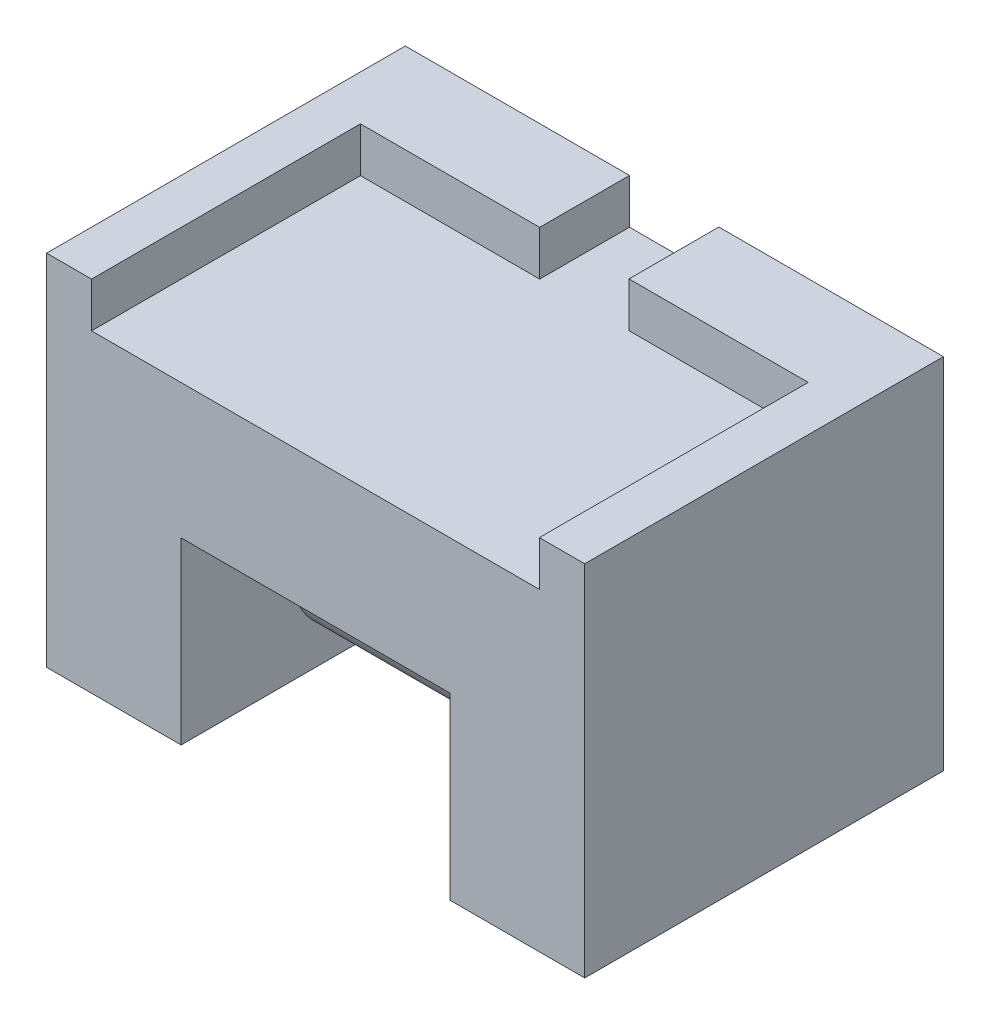
ISO-10303-21;
HEADER;
FILE_DESCRIPTION(('STEP AP214'),'2;1');
FILE_NAME('part.step','',(''),(''),'','','');
FILE_SCHEMA(('AUTOMOTIVE_DESIGN { 1 0 10303 214 1 1 1 1 }'));
ENDSEC;
DATA;
#1=APPLICATION_CONTEXT('core data for automotive mechanical design processes');
#2=APPLICATION_PROTOCOL_DEFINITION('international standard','automotive_design',2000,#1);
#3=PRODUCT_CONTEXT('',#1,'mechanical');
#4=PRODUCT('Part','Part','',(#3));
#5=PRODUCT_RELATED_PRODUCT_CATEGORY('part','',(#4));
#6=PRODUCT_DEFINITION_FORMATION('','',#4);
#7=PRODUCT_DEFINITION_CONTEXT('part definition',#1,'design');
#8=PRODUCT_DEFINITION('design','',#6,#7);
#9=PRODUCT_DEFINITION_SHAPE('','',#8);
#10=(LENGTH_UNIT() NAMED_UNIT(*) SI_UNIT(.MILLI.,.METRE.));
#11=(NAMED_UNIT(*) PLANE_ANGLE_UNIT() SI_UNIT($,.RADIAN.));
#12=(NAMED_UNIT(*) SI_UNIT($,.STERADIAN.) SOLID_ANGLE_UNIT());
#13=UNCERTAINTY_MEASURE_WITH_UNIT(LENGTH_MEASURE(1.E-05),#10,'distance_accuracy_value','');
#14=(GEOMETRIC_REPRESENTATION_CONTEXT(3) GLOBAL_UNCERTAINTY_ASSIGNED_CONTEXT((#13)) GLOBAL_UNIT_ASSIGNED_CONTEXT((#10,
#11,#12)) REPRESENTATION_CONTEXT('',''));
#15=CARTESIAN_POINT('',(0.,0.,0.));
#16=DIRECTION('',(0.,0.,1.));
#17=DIRECTION('',(1.,0.,0.));
#18=AXIS2_PLACEMENT_3D('',#15,#16,#17);
#19=CARTESIAN_POINT('',(-7.98087431693989,8.50136612021858,50.8));
#20=DIRECTION('',(0.,-1.,0.));
#21=DIRECTION('',(0.,0.,-1.));
#22=AXIS2_PLACEMENT_3D('',#19,#20,#21);
#23=PLANE('',#22);
#24=DIRECTION('',(0.,0.,-1.));
#25=VECTOR('',#24,1.);
#26=CARTESIAN_POINT('',(61.7980056830601,8.50136612021858,0.));
#27=LINE('',#26,#25);
#28=CARTESIAN_POINT('',(61.7980056830601,8.50136612021858,50.8));
#29=VERTEX_POINT('',#28);
#30=CARTESIAN_POINT('',(61.7980056830601,8.50136612021858,12.7254));
#31=VERTEX_POINT('',#30);
#32=EDGE_CURVE('E291',#29,#31,#27,.T.);
#33=ORIENTED_EDGE('',*,*,#32,.F.);
#34=DIRECTION('',(-1.,0.,0.));
#35=VECTOR('',#34,1.);
#36=CARTESIAN_POINT('',(-7.98087431693989,8.50136612021858,50.8));
#37=LINE('',#36,#35);
#38=CARTESIAN_POINT('',(68.2191256830601,8.50136612021858,50.8));
#39=VERTEX_POINT('',#38);
#40=EDGE_CURVE('E185',#39,#29,#37,.T.);
#41=ORIENTED_EDGE('',*,*,#40,.F.);
#42=DIRECTION('',(0.,0.,-1.));
#43=VECTOR('',#42,1.);
#44=CARTESIAN_POINT('',(68.2191256830601,8.50136612021858,50.8));
#45=LINE('',#44,#43);
#46=CARTESIAN_POINT('',(68.2191256830601,8.50136612021858,0.));
#47=VERTEX_POINT('',#46);
#48=EDGE_CURVE('E250',#39,#47,#45,.T.);
#49=ORIENTED_EDGE('',*,*,#48,.T.);
#50=DIRECTION('',(-1.,0.,0.));
#51=VECTOR('',#50,1.);
#52=CARTESIAN_POINT('',(-7.98087431693989,8.50136612021858,0.));
#53=LINE('',#52,#51);
#54=CARTESIAN_POINT('',(36.4183256830601,8.50136612021858,0.));
#55=VERTEX_POINT('',#54);
#56=EDGE_CURVE('E233',#47,#55,#53,.T.);
#57=ORIENTED_EDGE('',*,*,#56,.T.);
#58=DIRECTION('',(0.,0.,-1.));
#59=VECTOR('',#58,1.);
#60=CARTESIAN_POINT('',(36.4183256830601,8.50136612021858,0.));
#61=LINE('',#60,#59);
#62=CARTESIAN_POINT('',(36.4183256830601,8.50136612021858,12.7254));
#63=VERTEX_POINT('',#62);
#64=EDGE_CURVE('E296',#63,#55,#61,.T.);
#65=ORIENTED_EDGE('',*,*,#64,.F.);
#66=DIRECTION('',(1.,0.,0.));
#67=VECTOR('',#66,1.);
#68=CARTESIAN_POINT('',(0.,8.50136612021858,12.7254));
#69=LINE('',#68,#67);
#70=EDGE_CURVE('E298',#63,#31,#69,.T.);
#71=ORIENTED_EDGE('',*,*,#70,.T.);
#72=EDGE_LOOP('',(#33,#41,#49,#57,#65,#71));
#73=FACE_BOUND('',#72,.T.);
#74=ADVANCED_FACE('F43',(#73),#23,.F.);
#75=CARTESIAN_POINT('',(0.,0.,50.8));
#76=DIRECTION('',(0.,0.,1.));
#77=DIRECTION('',(1.,0.,0.));
#78=AXIS2_PLACEMENT_3D('',#75,#76,#77);
#79=PLANE('',#78);
#80=DIRECTION('',(1.,0.,0.));
#81=VECTOR('',#80,1.);
#82=CARTESIAN_POINT('',(0.,2.15136612021858,50.8));
#83=LINE('',#82,#81);
#84=CARTESIAN_POINT('',(-1.61055431693989,2.15136612021858,50.8));
#85=VERTEX_POINT('',#84);
#86=CARTESIAN_POINT('',(61.7980056830601,2.15136612021858,50.8));
#87=VERTEX_POINT('',#86);
#88=EDGE_CURVE('E166',#85,#87,#83,.T.);
#89=ORIENTED_EDGE('',*,*,#88,.F.);
#90=DIRECTION('',(0.,1.,0.));
#91=VECTOR('',#90,1.);
#92=CARTESIAN_POINT('',(-1.61055431693989,2.15136612021858,50.8));
#93=LINE('',#92,#91);
#94=CARTESIAN_POINT('',(-1.61055431693989,8.50136612021858,50.8));
#95=VERTEX_POINT('',#94);
#96=EDGE_CURVE('E213',#85,#95,#93,.T.);
#97=ORIENTED_EDGE('',*,*,#96,.T.);
#98=CARTESIAN_POINT('',(-7.98087431693989,8.50136612021858,50.8));
#99=VERTEX_POINT('',#98);
#100=EDGE_CURVE('E232',#95,#99,#37,.T.);
#101=ORIENTED_EDGE('',*,*,#100,.T.);
#102=DIRECTION('',(0.,-1.,0.));
#103=VECTOR('',#102,1.);
#104=CARTESIAN_POINT('',(-7.98087431693989,8.50136612021858,50.8));
#105=LINE('',#104,#103);
#106=CARTESIAN_POINT('',(-7.98087431693989,-42.2986338797814,50.8));
#107=VERTEX_POINT('',#106);
#108=EDGE_CURVE('E226',#99,#107,#105,.T.);
#109=ORIENTED_EDGE('',*,*,#108,.T.);
#110=DIRECTION('',(-1.,0.,0.));
#111=VECTOR('',#110,1.);
#112=CARTESIAN_POINT('',(-7.98087431693989,-42.2986338797814,50.8));
#113=LINE('',#112,#111);
#114=CARTESIAN_POINT('',(11.0691256830601,-42.2986338797814,50.8));
#115=VERTEX_POINT('',#114);
#116=EDGE_CURVE('E197',#115,#107,#113,.T.);
#117=ORIENTED_EDGE('',*,*,#116,.F.);
#118=DIRECTION('',(0.,1.,0.));
#119=VECTOR('',#118,1.);
#120=CARTESIAN_POINT('',(11.0691256830601,-42.2986338797814,50.8));
#121=LINE('',#120,#119);
#122=CARTESIAN_POINT('',(11.0691256830601,-16.8986338797814,50.8));
#123=VERTEX_POINT('',#122);
#124=EDGE_CURVE('E202',#115,#123,#121,.T.);
#125=ORIENTED_EDGE('',*,*,#124,.T.);
#126=DIRECTION('',(1.,0.,0.));
#127=VECTOR('',#126,1.);
#128=CARTESIAN_POINT('',(-7.98087431693989,-16.8986338797814,50.8));
#129=LINE('',#128,#127);
#130=CARTESIAN_POINT('',(49.1691256830601,-16.8986338797814,50.8));
#131=VERTEX_POINT('',#130);
#132=EDGE_CURVE('E229',#123,#131,#129,.T.);
#133=ORIENTED_EDGE('',*,*,#132,.T.);
#134=DIRECTION('',(0.,1.,0.));
#135=VECTOR('',#134,1.);
#136=CARTESIAN_POINT('',(49.1691256830601,-42.2986338797814,50.8));
#137=LINE('',#136,#135);
#138=CARTESIAN_POINT('',(49.1691256830601,-42.2986338797814,50.8));
#139=VERTEX_POINT('',#138);
#140=EDGE_CURVE('E208',#139,#131,#137,.T.);
#141=ORIENTED_EDGE('',*,*,#140,.F.);
#142=DIRECTION('',(-1.,0.,0.));
#143=VECTOR('',#142,1.);
#144=CARTESIAN_POINT('',(68.2191256830601,-42.2986338797814,50.8));
#145=LINE('',#144,#143);
#146=CARTESIAN_POINT('',(68.2191256830601,-42.2986338797814,50.8));
#147=VERTEX_POINT('',#146);
#148=EDGE_CURVE('E224',#147,#139,#145,.T.);
#149=ORIENTED_EDGE('',*,*,#148,.F.);
#150=DIRECTION('',(0.,1.,0.));
#151=VECTOR('',#150,1.);
#152=CARTESIAN_POINT('',(68.2191256830601,8.50136612021858,50.8));
#153=LINE('',#152,#151);
#154=EDGE_CURVE('E231',#147,#39,#153,.T.);
#155=ORIENTED_EDGE('',*,*,#154,.T.);
#156=ORIENTED_EDGE('',*,*,#40,.T.);
#157=DIRECTION('',(0.,1.,0.));
#158=VECTOR('',#157,1.);
#159=CARTESIAN_POINT('',(61.7980056830601,2.15136612021858,50.8));
#160=LINE('',#159,#158);
#161=EDGE_CURVE('E165',#87,#29,#160,.T.);
#162=ORIENTED_EDGE('',*,*,#161,.F.);
#163=EDGE_LOOP('',(#89,#97,#101,#109,#117,#125,#133,#141,#149,#155,#156,#162));
#164=FACE_BOUND('',#163,.T.);
#165=ADVANCED_FACE('F179',(#164),#79,.T.);
#166=CARTESIAN_POINT('',(-7.98087431693989,-16.8986338797814,50.8));
#167=DIRECTION('',(0.,1.,0.));
#168=DIRECTION('',(0.,0.,1.));
#169=AXIS2_PLACEMENT_3D('',#166,#167,#168);
#170=PLANE('',#169);
#171=DIRECTION('',(0.,0.,1.));
#172=VECTOR('',#171,1.);
#173=CARTESIAN_POINT('',(11.0691256830601,-16.8986338797814,50.8));
#174=LINE('',#173,#172);
#175=CARTESIAN_POINT('',(11.0691256830601,-16.8986338797814,0.));
#176=VERTEX_POINT('',#175);
#177=EDGE_CURVE('E193',#176,#123,#174,.T.);
#178=ORIENTED_EDGE('',*,*,#177,.F.);
#179=DIRECTION('',(1.,0.,0.));
#180=VECTOR('',#179,1.);
#181=CARTESIAN_POINT('',(-7.98087431693989,-16.8986338797814,0.));
#182=LINE('',#181,#180);
#183=CARTESIAN_POINT('',(49.1691256830601,-16.8986338797814,0.));
#184=VERTEX_POINT('',#183);
#185=EDGE_CURVE('E237',#176,#184,#182,.T.);
#186=ORIENTED_EDGE('',*,*,#185,.T.);
#187=DIRECTION('',(0.,0.,-1.));
#188=VECTOR('',#187,1.);
#189=CARTESIAN_POINT('',(49.1691256830601,-16.8986338797814,50.8));
#190=LINE('',#189,#188);
#191=EDGE_CURVE('E69',#131,#184,#190,.T.);
#192=ORIENTED_EDGE('',*,*,#191,.F.);
#193=ORIENTED_EDGE('',*,*,#132,.F.);
#194=EDGE_LOOP('',(#178,#186,#192,#193));
#195=FACE_BOUND('',#194,.T.);
#196=ADVANCED_FACE('F282',(#195),#170,.F.);
#197=CARTESIAN_POINT('',(-7.98087431693989,8.50136612021858,50.8));
#198=DIRECTION('',(1.,0.,0.));
#199=DIRECTION('',(0.,1.,0.));
#200=AXIS2_PLACEMENT_3D('',#197,#198,#199);
#201=PLANE('',#200);
#202=DIRECTION('',(0.,-1.,0.));
#203=VECTOR('',#202,1.);
#204=CARTESIAN_POINT('',(-7.98087431693989,8.50136612021858,0.));
#205=LINE('',#204,#203);
#206=CARTESIAN_POINT('',(-7.98087431693989,8.50136612021858,0.));
#207=VERTEX_POINT('',#206);
#208=CARTESIAN_POINT('',(-7.98087431693989,-42.2986338797814,0.));
#209=VERTEX_POINT('',#208);
#210=EDGE_CURVE('E209',#207,#209,#205,.T.);
#211=ORIENTED_EDGE('',*,*,#210,.T.);
#212=DIRECTION('',(0.,0.,-1.));
#213=VECTOR('',#212,1.);
#214=CARTESIAN_POINT('',(-7.98087431693989,-42.2986338797814,50.8));
#215=LINE('',#214,#213);
#216=EDGE_CURVE('E188',#107,#209,#215,.T.);
#217=ORIENTED_EDGE('',*,*,#216,.F.);
#218=ORIENTED_EDGE('',*,*,#108,.F.);
#219=DIRECTION('',(0.,0.,-1.));
#220=VECTOR('',#219,1.);
#221=CARTESIAN_POINT('',(-7.98087431693989,8.50136612021858,50.8));
#222=LINE('',#221,#220);
#223=EDGE_CURVE('E240',#99,#207,#222,.T.);
#224=ORIENTED_EDGE('',*,*,#223,.T.);
#225=EDGE_LOOP('',(#211,#217,#218,#224));
#226=FACE_BOUND('',#225,.T.);
#227=ADVANCED_FACE('F44',(#226),#201,.F.);
#228=CARTESIAN_POINT('',(68.2191256830601,8.50136612021858,50.8));
#229=DIRECTION('',(-1.,0.,0.));
#230=DIRECTION('',(0.,0.,1.));
#231=AXIS2_PLACEMENT_3D('',#228,#229,#230);
#232=PLANE('',#231);
#233=DIRECTION('',(0.,1.,0.));
#234=VECTOR('',#233,1.);
#235=CARTESIAN_POINT('',(68.2191256830601,8.50136612021858,0.));
#236=LINE('',#235,#234);
#237=CARTESIAN_POINT('',(68.2191256830601,-42.2986338797814,0.));
#238=VERTEX_POINT('',#237);
#239=EDGE_CURVE('E241',#238,#47,#236,.T.);
#240=ORIENTED_EDGE('',*,*,#239,.T.);
#241=ORIENTED_EDGE('',*,*,#48,.F.);
#242=ORIENTED_EDGE('',*,*,#154,.F.);
#243=DIRECTION('',(0.,0.,1.));
#244=VECTOR('',#243,1.);
#245=CARTESIAN_POINT('',(68.2191256830601,-42.2986338797814,50.8));
#246=LINE('',#245,#244);
#247=EDGE_CURVE('E220',#238,#147,#246,.T.);
#248=ORIENTED_EDGE('',*,*,#247,.F.);
#249=EDGE_LOOP('',(#240,#241,#242,#248));
#250=FACE_BOUND('',#249,.T.);
#251=ADVANCED_FACE('F293',(#250),#232,.F.);
#252=CARTESIAN_POINT('',(-1.61055431693989,8.50136612021858,12.7254));
#253=VERTEX_POINT('',#252);
#254=CARTESIAN_POINT('',(23.7691256830601,8.50136612021858,12.7254));
#255=VERTEX_POINT('',#254);
#256=EDGE_CURVE('E297',#253,#255,#69,.T.);
#257=ORIENTED_EDGE('',*,*,#256,.T.);
#258=DIRECTION('',(0.,0.,-1.));
#259=VECTOR('',#258,1.);
#260=CARTESIAN_POINT('',(23.7691256830601,8.50136612021858,0.));
#261=LINE('',#260,#259);
#262=CARTESIAN_POINT('',(23.7691256830601,8.50136612021858,0.));
#263=VERTEX_POINT('',#262);
#264=EDGE_CURVE('E302',#255,#263,#261,.T.);
#265=ORIENTED_EDGE('',*,*,#264,.T.);
#266=EDGE_CURVE('E243',#263,#207,#53,.T.);
#267=ORIENTED_EDGE('',*,*,#266,.T.);
#268=ORIENTED_EDGE('',*,*,#223,.F.);
#269=ORIENTED_EDGE('',*,*,#100,.F.);
#270=DIRECTION('',(0.,0.,-1.));
#271=VECTOR('',#270,1.);
#272=CARTESIAN_POINT('',(-1.61055431693989,8.50136612021858,0.));
#273=LINE('',#272,#271);
#274=EDGE_CURVE('E180',#95,#253,#273,.T.);
#275=ORIENTED_EDGE('',*,*,#274,.T.);
#276=EDGE_LOOP('',(#257,#265,#267,#268,#269,#275));
#277=FACE_BOUND('',#276,.T.);
#278=ADVANCED_FACE('F339',(#277),#23,.F.);
#279=CARTESIAN_POINT('',(0.,0.,0.));
#280=DIRECTION('',(0.,0.,1.));
#281=DIRECTION('',(1.,0.,0.));
#282=AXIS2_PLACEMENT_3D('',#279,#280,#281);
#283=PLANE('',#282);
#284=DIRECTION('',(-1.,0.,0.));
#285=VECTOR('',#284,1.);
#286=CARTESIAN_POINT('',(0.,2.15136612021858,0.));
#287=LINE('',#286,#285);
#288=CARTESIAN_POINT('',(36.4183256830601,2.15136612021858,0.));
#289=VERTEX_POINT('',#288);
#290=CARTESIAN_POINT('',(23.7691256830601,2.15136612021858,0.));
#291=VERTEX_POINT('',#290);
#292=EDGE_CURVE('E325',#289,#291,#287,.T.);
#293=ORIENTED_EDGE('',*,*,#292,.F.);
#294=DIRECTION('',(0.,1.,0.));
#295=VECTOR('',#294,1.);
#296=CARTESIAN_POINT('',(36.4183256830601,2.15136612021858,0.));
#297=LINE('',#296,#295);
#298=EDGE_CURVE('E317',#289,#55,#297,.T.);
#299=ORIENTED_EDGE('',*,*,#298,.T.);
#300=ORIENTED_EDGE('',*,*,#56,.F.);
#301=ORIENTED_EDGE('',*,*,#239,.F.);
#302=DIRECTION('',(1.,0.,0.));
#303=VECTOR('',#302,1.);
#304=CARTESIAN_POINT('',(68.2191256830601,-42.2986338797814,0.));
#305=LINE('',#304,#303);
#306=CARTESIAN_POINT('',(49.1691256830601,-42.2986338797814,0.));
#307=VERTEX_POINT('',#306);
#308=EDGE_CURVE('E219',#307,#238,#305,.T.);
#309=ORIENTED_EDGE('',*,*,#308,.F.);
#310=DIRECTION('',(0.,1.,0.));
#311=VECTOR('',#310,1.);
#312=CARTESIAN_POINT('',(49.1691256830601,-42.2986338797814,0.));
#313=LINE('',#312,#311);
#314=EDGE_CURVE('E215',#307,#184,#313,.T.);
#315=ORIENTED_EDGE('',*,*,#314,.T.);
#316=ORIENTED_EDGE('',*,*,#185,.F.);
#317=DIRECTION('',(0.,1.,0.));
#318=VECTOR('',#317,1.);
#319=CARTESIAN_POINT('',(11.0691256830601,-42.2986338797814,0.));
#320=LINE('',#319,#318);
#321=CARTESIAN_POINT('',(11.0691256830601,-42.2986338797814,0.));
#322=VERTEX_POINT('',#321);
#323=EDGE_CURVE('E207',#322,#176,#320,.T.);
#324=ORIENTED_EDGE('',*,*,#323,.F.);
#325=DIRECTION('',(1.,0.,0.));
#326=VECTOR('',#325,1.);
#327=CARTESIAN_POINT('',(-7.98087431693989,-42.2986338797814,0.));
#328=LINE('',#327,#326);
#329=EDGE_CURVE('E195',#209,#322,#328,.T.);
#330=ORIENTED_EDGE('',*,*,#329,.F.);
#331=ORIENTED_EDGE('',*,*,#210,.F.);
#332=ORIENTED_EDGE('',*,*,#266,.F.);
#333=DIRECTION('',(0.,1.,0.));
#334=VECTOR('',#333,1.);
#335=CARTESIAN_POINT('',(23.7691256830601,2.15136612021858,0.));
#336=LINE('',#335,#334);
#337=EDGE_CURVE('E313',#291,#263,#336,.T.);
#338=ORIENTED_EDGE('',*,*,#337,.F.);
#339=EDGE_LOOP('',(#293,#299,#300,#301,#309,#315,#316,#324,#330,#331,#332,#338));
#340=FACE_BOUND('',#339,.T.);
#341=ADVANCED_FACE('F277',(#340),#283,.F.);
#342=CARTESIAN_POINT('',(49.1691256830601,-42.2986338797814,50.8));
#343=DIRECTION('',(1.,0.,0.));
#344=DIRECTION('',(0.,0.,-1.));
#345=AXIS2_PLACEMENT_3D('',#342,#343,#344);
#346=PLANE('',#345);
#347=CARTESIAN_POINT('',(49.1691256830601,-29.5986338797814,25.4));
#348=DIRECTION('',(1.,0.,0.));
#349=DIRECTION('',(0.,0.,-1.));
#350=AXIS2_PLACEMENT_3D('',#347,#348,#349);
#351=CIRCLE('',#350,9.525);
#352=CARTESIAN_POINT('',(49.1691256830601,-29.5986338797814,15.875));
#353=VERTEX_POINT('',#352);
#354=EDGE_CURVE('E11',#353,#353,#351,.F.);
#355=ORIENTED_EDGE('',*,*,#354,.F.);
#356=EDGE_LOOP('',(#355));
#357=FACE_BOUND('',#356,.T.);
#358=ORIENTED_EDGE('',*,*,#191,.T.);
#359=ORIENTED_EDGE('',*,*,#314,.F.);
#360=DIRECTION('',(0.,0.,-1.));
#361=VECTOR('',#360,1.);
#362=CARTESIAN_POINT('',(49.1691256830601,-42.2986338797814,50.8));
#363=LINE('',#362,#361);
#364=EDGE_CURVE('E225',#139,#307,#363,.T.);
#365=ORIENTED_EDGE('',*,*,#364,.F.);
#366=ORIENTED_EDGE('',*,*,#140,.T.);
#367=EDGE_LOOP('',(#358,#359,#365,#366));
#368=FACE_BOUND('',#367,.T.);
#369=ADVANCED_FACE('F281',(#357,#368),#346,.F.);
#370=CARTESIAN_POINT('',(0.,-42.2986338797814,0.));
#371=DIRECTION('',(0.,1.,0.));
#372=DIRECTION('',(0.,0.,1.));
#373=AXIS2_PLACEMENT_3D('',#370,#371,#372);
#374=PLANE('',#373);
#375=ORIENTED_EDGE('',*,*,#247,.T.);
#376=ORIENTED_EDGE('',*,*,#148,.T.);
#377=ORIENTED_EDGE('',*,*,#364,.T.);
#378=ORIENTED_EDGE('',*,*,#308,.T.);
#379=EDGE_LOOP('',(#375,#376,#377,#378));
#380=FACE_BOUND('',#379,.T.);
#381=ADVANCED_FACE('F264',(#380),#374,.F.);
#382=CARTESIAN_POINT('',(11.0691256830601,-42.2986338797814,50.8));
#383=DIRECTION('',(-1.,0.,0.));
#384=DIRECTION('',(0.,0.,1.));
#385=AXIS2_PLACEMENT_3D('',#382,#383,#384);
#386=PLANE('',#385);
#387=CARTESIAN_POINT('',(11.0691256830601,-29.5986338797814,25.4));
#388=DIRECTION('',(-1.,0.,0.));
#389=DIRECTION('',(0.,0.,1.));
#390=AXIS2_PLACEMENT_3D('',#387,#388,#389);
#391=CIRCLE('',#390,9.525);
#392=CARTESIAN_POINT('',(11.0691256830601,-29.5986338797814,34.925));
#393=VERTEX_POINT('',#392);
#394=EDGE_CURVE('E50',#393,#393,#391,.F.);
#395=ORIENTED_EDGE('',*,*,#394,.F.);
#396=EDGE_LOOP('',(#395));
#397=FACE_BOUND('',#396,.T.);
#398=ORIENTED_EDGE('',*,*,#177,.T.);
#399=ORIENTED_EDGE('',*,*,#124,.F.);
#400=DIRECTION('',(0.,0.,1.));
#401=VECTOR('',#400,1.);
#402=CARTESIAN_POINT('',(11.0691256830601,-42.2986338797814,50.8));
#403=LINE('',#402,#401);
#404=EDGE_CURVE('E198',#322,#115,#403,.T.);
#405=ORIENTED_EDGE('',*,*,#404,.F.);
#406=ORIENTED_EDGE('',*,*,#323,.T.);
#407=EDGE_LOOP('',(#398,#399,#405,#406));
#408=FACE_BOUND('',#407,.T.);
#409=ADVANCED_FACE('F260',(#397,#408),#386,.F.);
#410=CARTESIAN_POINT('',(0.,-42.2986338797814,0.));
#411=DIRECTION('',(0.,-1.,0.));
#412=DIRECTION('',(0.,0.,-1.));
#413=AXIS2_PLACEMENT_3D('',#410,#411,#412);
#414=PLANE('',#413);
#415=ORIENTED_EDGE('',*,*,#216,.T.);
#416=ORIENTED_EDGE('',*,*,#329,.T.);
#417=ORIENTED_EDGE('',*,*,#404,.T.);
#418=ORIENTED_EDGE('',*,*,#116,.T.);
#419=EDGE_LOOP('',(#415,#416,#417,#418));
#420=FACE_BOUND('',#419,.T.);
#421=ADVANCED_FACE('F263',(#420),#414,.T.);
#422=CARTESIAN_POINT('',(61.8691256830601,-29.5986338797814,25.4));
#423=DIRECTION('',(-1.,0.,0.));
#424=DIRECTION('',(0.,0.,1.));
#425=AXIS2_PLACEMENT_3D('',#422,#423,#424);
#426=CYLINDRICAL_SURFACE('',#425,9.525);
#427=ORIENTED_EDGE('',*,*,#394,.T.);
#428=EDGE_LOOP('',(#427));
#429=FACE_BOUND('',#428,.T.);
#430=ORIENTED_EDGE('',*,*,#354,.T.);
#431=EDGE_LOOP('',(#430));
#432=FACE_BOUND('',#431,.T.);
#433=ADVANCED_FACE('F253',(#429,#432),#426,.T.);
#434=CARTESIAN_POINT('',(-1.61055431693989,2.15136612021858,0.));
#435=DIRECTION('',(1.,0.,0.));
#436=DIRECTION('',(0.,0.,-1.));
#437=AXIS2_PLACEMENT_3D('',#434,#435,#436);
#438=PLANE('',#437);
#439=ORIENTED_EDGE('',*,*,#274,.F.);
#440=ORIENTED_EDGE('',*,*,#96,.F.);
#441=DIRECTION('',(0.,0.,-1.));
#442=VECTOR('',#441,1.);
#443=CARTESIAN_POINT('',(-1.61055431693989,2.15136612021858,0.));
#444=LINE('',#443,#442);
#445=CARTESIAN_POINT('',(-1.61055431693989,2.15136612021858,12.7254));
#446=VERTEX_POINT('',#445);
#447=EDGE_CURVE('E172',#85,#446,#444,.T.);
#448=ORIENTED_EDGE('',*,*,#447,.T.);
#449=DIRECTION('',(0.,1.,0.));
#450=VECTOR('',#449,1.);
#451=CARTESIAN_POINT('',(-1.61055431693989,2.15136612021858,12.7254));
#452=LINE('',#451,#450);
#453=EDGE_CURVE('E309',#446,#253,#452,.T.);
#454=ORIENTED_EDGE('',*,*,#453,.T.);
#455=EDGE_LOOP('',(#439,#440,#448,#454));
#456=FACE_BOUND('',#455,.T.);
#457=ADVANCED_FACE('F341',(#456),#438,.T.);
#458=CARTESIAN_POINT('',(0.,2.15136612021858,12.7254));
#459=DIRECTION('',(0.,0.,1.));
#460=DIRECTION('',(1.,0.,0.));
#461=AXIS2_PLACEMENT_3D('',#458,#459,#460);
#462=PLANE('',#461);
#463=ORIENTED_EDGE('',*,*,#256,.F.);
#464=ORIENTED_EDGE('',*,*,#453,.F.);
#465=DIRECTION('',(1.,0.,0.));
#466=VECTOR('',#465,1.);
#467=CARTESIAN_POINT('',(0.,2.15136612021858,12.7254));
#468=LINE('',#467,#466);
#469=CARTESIAN_POINT('',(23.7691256830601,2.15136612021858,12.7254));
#470=VERTEX_POINT('',#469);
#471=EDGE_CURVE('E187',#446,#470,#468,.T.);
#472=ORIENTED_EDGE('',*,*,#471,.T.);
#473=DIRECTION('',(0.,1.,0.));
#474=VECTOR('',#473,1.);
#475=CARTESIAN_POINT('',(23.7691256830601,2.15136612021858,12.7254));
#476=LINE('',#475,#474);
#477=EDGE_CURVE('E315',#470,#255,#476,.T.);
#478=ORIENTED_EDGE('',*,*,#477,.T.);
#479=EDGE_LOOP('',(#463,#464,#472,#478));
#480=FACE_BOUND('',#479,.T.);
#481=ADVANCED_FACE('F333',(#480),#462,.T.);
#482=CARTESIAN_POINT('',(23.7691256830601,2.15136612021858,0.));
#483=DIRECTION('',(1.,0.,0.));
#484=DIRECTION('',(0.,0.,-1.));
#485=AXIS2_PLACEMENT_3D('',#482,#483,#484);
#486=PLANE('',#485);
#487=ORIENTED_EDGE('',*,*,#264,.F.);
#488=ORIENTED_EDGE('',*,*,#477,.F.);
#489=DIRECTION('',(0.,0.,-1.));
#490=VECTOR('',#489,1.);
#491=CARTESIAN_POINT('',(23.7691256830601,2.15136612021858,0.));
#492=LINE('',#491,#490);
#493=EDGE_CURVE('E322',#470,#291,#492,.T.);
#494=ORIENTED_EDGE('',*,*,#493,.T.);
#495=ORIENTED_EDGE('',*,*,#337,.T.);
#496=EDGE_LOOP('',(#487,#488,#494,#495));
#497=FACE_BOUND('',#496,.T.);
#498=ADVANCED_FACE('F337',(#497),#486,.T.);
#499=CARTESIAN_POINT('',(36.4183256830601,2.15136612021858,0.));
#500=DIRECTION('',(1.,0.,0.));
#501=DIRECTION('',(0.,0.,-1.));
#502=AXIS2_PLACEMENT_3D('',#499,#500,#501);
#503=PLANE('',#502);
#504=ORIENTED_EDGE('',*,*,#64,.T.);
#505=ORIENTED_EDGE('',*,*,#298,.F.);
#506=DIRECTION('',(0.,0.,-1.));
#507=VECTOR('',#506,1.);
#508=CARTESIAN_POINT('',(36.4183256830601,2.15136612021858,0.));
#509=LINE('',#508,#507);
#510=CARTESIAN_POINT('',(36.4183256830601,2.15136612021858,12.7254));
#511=VERTEX_POINT('',#510);
#512=EDGE_CURVE('E56',#511,#289,#509,.T.);
#513=ORIENTED_EDGE('',*,*,#512,.F.);
#514=DIRECTION('',(0.,1.,0.));
#515=VECTOR('',#514,1.);
#516=CARTESIAN_POINT('',(36.4183256830601,2.15136612021858,12.7254));
#517=LINE('',#516,#515);
#518=EDGE_CURVE('E183',#511,#63,#517,.T.);
#519=ORIENTED_EDGE('',*,*,#518,.T.);
#520=EDGE_LOOP('',(#504,#505,#513,#519));
#521=FACE_BOUND('',#520,.T.);
#522=ADVANCED_FACE('F316',(#521),#503,.F.);
#523=ORIENTED_EDGE('',*,*,#70,.F.);
#524=ORIENTED_EDGE('',*,*,#518,.F.);
#525=CARTESIAN_POINT('',(61.7980056830601,2.15136612021858,12.7254));
#526=VERTEX_POINT('',#525);
#527=EDGE_CURVE('E170',#511,#526,#468,.T.);
#528=ORIENTED_EDGE('',*,*,#527,.T.);
#529=DIRECTION('',(0.,1.,0.));
#530=VECTOR('',#529,1.);
#531=CARTESIAN_POINT('',(61.7980056830601,2.15136612021858,12.7254));
#532=LINE('',#531,#530);
#533=EDGE_CURVE('E168',#526,#31,#532,.T.);
#534=ORIENTED_EDGE('',*,*,#533,.T.);
#535=EDGE_LOOP('',(#523,#524,#528,#534));
#536=FACE_BOUND('',#535,.T.);
#537=ADVANCED_FACE('F324',(#536),#462,.T.);
#538=CARTESIAN_POINT('',(61.7980056830601,2.15136612021858,0.));
#539=DIRECTION('',(1.,0.,0.));
#540=DIRECTION('',(0.,0.,-1.));
#541=AXIS2_PLACEMENT_3D('',#538,#539,#540);
#542=PLANE('',#541);
#543=ORIENTED_EDGE('',*,*,#32,.T.);
#544=ORIENTED_EDGE('',*,*,#533,.F.);
#545=DIRECTION('',(0.,0.,-1.));
#546=VECTOR('',#545,1.);
#547=CARTESIAN_POINT('',(61.7980056830601,2.15136612021858,0.));
#548=LINE('',#547,#546);
#549=EDGE_CURVE('E159',#87,#526,#548,.T.);
#550=ORIENTED_EDGE('',*,*,#549,.F.);
#551=ORIENTED_EDGE('',*,*,#161,.T.);
#552=EDGE_LOOP('',(#543,#544,#550,#551));
#553=FACE_BOUND('',#552,.T.);
#554=ADVANCED_FACE('F162',(#553),#542,.F.);
#555=CARTESIAN_POINT('',(0.,2.15136612021858,0.));
#556=DIRECTION('',(0.,1.,0.));
#557=DIRECTION('',(0.,0.,1.));
#558=AXIS2_PLACEMENT_3D('',#555,#556,#557);
#559=PLANE('',#558);
#560=ORIENTED_EDGE('',*,*,#88,.T.);
#561=ORIENTED_EDGE('',*,*,#549,.T.);
#562=ORIENTED_EDGE('',*,*,#527,.F.);
#563=ORIENTED_EDGE('',*,*,#512,.T.);
#564=ORIENTED_EDGE('',*,*,#292,.T.);
#565=ORIENTED_EDGE('',*,*,#493,.F.);
#566=ORIENTED_EDGE('',*,*,#471,.F.);
#567=ORIENTED_EDGE('',*,*,#447,.F.);
#568=EDGE_LOOP('',(#560,#561,#562,#563,#564,#565,#566,#567));
#569=FACE_BOUND('',#568,.T.);
#570=ADVANCED_FACE('F175',(#569),#559,.T.);
#571=CLOSED_SHELL('',(#74,#165,#196,#227,#251,#278,#341,#369,#381,#409,#421,#433,#457,#481,#498,
#522,#537,#554,#570));
#572=MANIFOLD_SOLID_BREP('B2',#571);
#573=ADVANCED_BREP_SHAPE_REPRESENTATION('',(#18,#572),#14);
#574=SHAPE_DEFINITION_REPRESENTATION(#9,#573);
ENDSEC;
END-ISO-10303-21;
